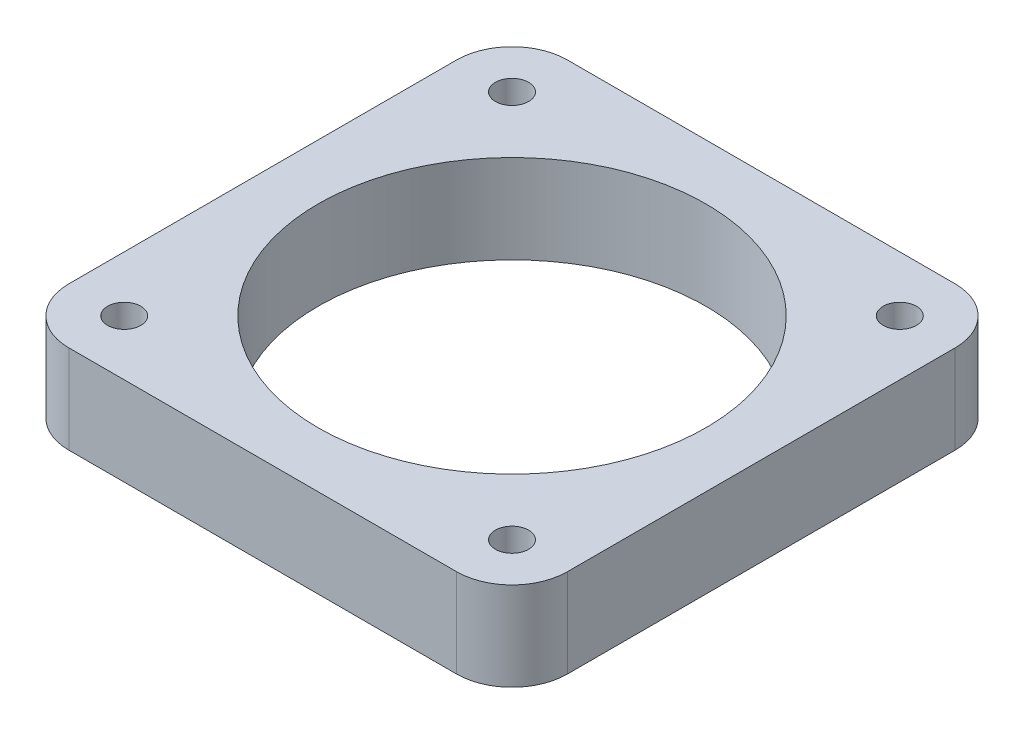
ISO-10303-21;
HEADER;
FILE_DESCRIPTION(('STEP AP214'),'2;1');
FILE_NAME('part.step','',(''),(''),'','','');
FILE_SCHEMA(('AUTOMOTIVE_DESIGN { 1 0 10303 214 1 1 1 1 }'));
ENDSEC;
DATA;
#1=APPLICATION_CONTEXT('core data for automotive mechanical design processes');
#2=APPLICATION_PROTOCOL_DEFINITION('international standard','automotive_design',2000,#1);
#3=PRODUCT_CONTEXT('',#1,'mechanical');
#4=PRODUCT('Part','Part','',(#3));
#5=PRODUCT_RELATED_PRODUCT_CATEGORY('part','',(#4));
#6=PRODUCT_DEFINITION_FORMATION('','',#4);
#7=PRODUCT_DEFINITION_CONTEXT('part definition',#1,'design');
#8=PRODUCT_DEFINITION('design','',#6,#7);
#9=PRODUCT_DEFINITION_SHAPE('','',#8);
#10=(LENGTH_UNIT() NAMED_UNIT(*) SI_UNIT(.MILLI.,.METRE.));
#11=(NAMED_UNIT(*) PLANE_ANGLE_UNIT() SI_UNIT($,.RADIAN.));
#12=(NAMED_UNIT(*) SI_UNIT($,.STERADIAN.) SOLID_ANGLE_UNIT());
#13=UNCERTAINTY_MEASURE_WITH_UNIT(LENGTH_MEASURE(1.E-05),#10,'distance_accuracy_value','');
#14=(GEOMETRIC_REPRESENTATION_CONTEXT(3) GLOBAL_UNCERTAINTY_ASSIGNED_CONTEXT((#13)) GLOBAL_UNIT_ASSIGNED_CONTEXT((#10,
#11,#12)) REPRESENTATION_CONTEXT('',''));
#15=CARTESIAN_POINT('',(0.,0.,0.));
#16=DIRECTION('',(0.,0.,1.));
#17=DIRECTION('',(1.,0.,0.));
#18=AXIS2_PLACEMENT_3D('',#15,#16,#17);
#19=CARTESIAN_POINT('',(0.,8.,22.5000000000002));
#20=DIRECTION('',(0.,0.,-1.));
#21=DIRECTION('',(-1.,0.,0.));
#22=AXIS2_PLACEMENT_3D('',#19,#20,#21);
#23=PLANE('',#22);
#24=DIRECTION('',(1.,0.,0.));
#25=VECTOR('',#24,1.);
#26=CARTESIAN_POINT('',(0.,8.,22.5000000000002));
#27=LINE('',#26,#25);
#28=CARTESIAN_POINT('',(-17.5,8.,22.5000000000002));
#29=VERTEX_POINT('',#28);
#30=CARTESIAN_POINT('',(17.5,8.,22.5000000000002));
#31=VERTEX_POINT('',#30);
#32=EDGE_CURVE('E128',#29,#31,#27,.T.);
#33=ORIENTED_EDGE('',*,*,#32,.F.);
#34=DIRECTION('',(0.,-1.,0.));
#35=VECTOR('',#34,1.);
#36=CARTESIAN_POINT('',(-17.5,0.,22.5000000000002));
#37=LINE('',#36,#35);
#38=CARTESIAN_POINT('',(-17.5,0.,22.5000000000002));
#39=VERTEX_POINT('',#38);
#40=EDGE_CURVE('E112',#29,#39,#37,.T.);
#41=ORIENTED_EDGE('',*,*,#40,.T.);
#42=DIRECTION('',(1.,0.,0.));
#43=VECTOR('',#42,1.);
#44=CARTESIAN_POINT('',(0.,0.,22.5000000000002));
#45=LINE('',#44,#43);
#46=CARTESIAN_POINT('',(17.5,0.,22.5000000000002));
#47=VERTEX_POINT('',#46);
#48=EDGE_CURVE('E125',#39,#47,#45,.T.);
#49=ORIENTED_EDGE('',*,*,#48,.T.);
#50=DIRECTION('',(0.,-1.,0.));
#51=VECTOR('',#50,1.);
#52=CARTESIAN_POINT('',(17.5,8.,22.5000000000002));
#53=LINE('',#52,#51);
#54=EDGE_CURVE('E131',#47,#31,#53,.F.);
#55=ORIENTED_EDGE('',*,*,#54,.T.);
#56=EDGE_LOOP('',(#33,#41,#49,#55));
#57=FACE_BOUND('',#56,.T.);
#58=ADVANCED_FACE('F41',(#57),#23,.F.);
#59=CARTESIAN_POINT('',(22.5,8.,0.));
#60=DIRECTION('',(-1.,0.,0.));
#61=DIRECTION('',(0.,0.,1.));
#62=AXIS2_PLACEMENT_3D('',#59,#60,#61);
#63=PLANE('',#62);
#64=DIRECTION('',(0.,0.,-1.));
#65=VECTOR('',#64,1.);
#66=CARTESIAN_POINT('',(22.5,0.,0.));
#67=LINE('',#66,#65);
#68=CARTESIAN_POINT('',(22.5,0.,17.5000000000002));
#69=VERTEX_POINT('',#68);
#70=CARTESIAN_POINT('',(22.5,0.,-17.5000000000002));
#71=VERTEX_POINT('',#70);
#72=EDGE_CURVE('E136',#69,#71,#67,.T.);
#73=ORIENTED_EDGE('',*,*,#72,.T.);
#74=DIRECTION('',(0.,-1.,0.));
#75=VECTOR('',#74,1.);
#76=CARTESIAN_POINT('',(22.5,8.,-17.5000000000002));
#77=LINE('',#76,#75);
#78=CARTESIAN_POINT('',(22.5,8.,-17.5000000000002));
#79=VERTEX_POINT('',#78);
#80=EDGE_CURVE('E11',#71,#79,#77,.F.);
#81=ORIENTED_EDGE('',*,*,#80,.T.);
#82=DIRECTION('',(0.,0.,-1.));
#83=VECTOR('',#82,1.);
#84=CARTESIAN_POINT('',(22.5,8.,0.));
#85=LINE('',#84,#83);
#86=CARTESIAN_POINT('',(22.5,8.,17.5000000000002));
#87=VERTEX_POINT('',#86);
#88=EDGE_CURVE('E194',#87,#79,#85,.T.);
#89=ORIENTED_EDGE('',*,*,#88,.F.);
#90=DIRECTION('',(0.,-1.,0.));
#91=VECTOR('',#90,1.);
#92=CARTESIAN_POINT('',(22.5,8.,17.5000000000002));
#93=LINE('',#92,#91);
#94=EDGE_CURVE('E50',#87,#69,#93,.T.);
#95=ORIENTED_EDGE('',*,*,#94,.T.);
#96=EDGE_LOOP('',(#73,#81,#89,#95));
#97=FACE_BOUND('',#96,.T.);
#98=ADVANCED_FACE('F192',(#97),#63,.F.);
#99=CARTESIAN_POINT('',(0.,8.,-22.5000000000002));
#100=DIRECTION('',(0.,0.,-1.));
#101=DIRECTION('',(-1.,0.,0.));
#102=AXIS2_PLACEMENT_3D('',#99,#100,#101);
#103=PLANE('',#102);
#104=DIRECTION('',(1.,0.,0.));
#105=VECTOR('',#104,1.);
#106=CARTESIAN_POINT('',(0.,0.,-22.5000000000002));
#107=LINE('',#106,#105);
#108=CARTESIAN_POINT('',(-17.5,0.,-22.5000000000002));
#109=VERTEX_POINT('',#108);
#110=CARTESIAN_POINT('',(17.5,0.,-22.5000000000002));
#111=VERTEX_POINT('',#110);
#112=EDGE_CURVE('E142',#109,#111,#107,.T.);
#113=ORIENTED_EDGE('',*,*,#112,.F.);
#114=DIRECTION('',(0.,-1.,0.));
#115=VECTOR('',#114,1.);
#116=CARTESIAN_POINT('',(-17.5,8.,-22.5000000000002));
#117=LINE('',#116,#115);
#118=CARTESIAN_POINT('',(-17.5,8.,-22.5000000000002));
#119=VERTEX_POINT('',#118);
#120=EDGE_CURVE('E64',#109,#119,#117,.F.);
#121=ORIENTED_EDGE('',*,*,#120,.T.);
#122=DIRECTION('',(1.,0.,0.));
#123=VECTOR('',#122,1.);
#124=CARTESIAN_POINT('',(0.,8.,-22.5000000000002));
#125=LINE('',#124,#123);
#126=CARTESIAN_POINT('',(17.5,8.,-22.5000000000002));
#127=VERTEX_POINT('',#126);
#128=EDGE_CURVE('E201',#119,#127,#125,.T.);
#129=ORIENTED_EDGE('',*,*,#128,.T.);
#130=DIRECTION('',(0.,-1.,0.));
#131=VECTOR('',#130,1.);
#132=CARTESIAN_POINT('',(17.5,0.,-22.5000000000002));
#133=LINE('',#132,#131);
#134=EDGE_CURVE('E182',#127,#111,#133,.T.);
#135=ORIENTED_EDGE('',*,*,#134,.T.);
#136=EDGE_LOOP('',(#113,#121,#129,#135));
#137=FACE_BOUND('',#136,.T.);
#138=ADVANCED_FACE('F200',(#137),#103,.T.);
#139=CARTESIAN_POINT('',(17.5,8.,17.5));
#140=DIRECTION('',(0.,-1.,0.));
#141=DIRECTION('',(0.,0.,-1.));
#142=AXIS2_PLACEMENT_3D('',#139,#140,#141);
#143=CYLINDRICAL_SURFACE('',#142,1.5);
#144=CARTESIAN_POINT('',(17.5,8.,17.5));
#145=DIRECTION('',(0.,1.,0.));
#146=DIRECTION('',(0.,0.,1.));
#147=AXIS2_PLACEMENT_3D('',#144,#145,#146);
#148=CIRCLE('',#147,1.5);
#149=CARTESIAN_POINT('',(17.5,8.,19.));
#150=VERTEX_POINT('',#149);
#151=EDGE_CURVE('E283',#150,#150,#148,.T.);
#152=ORIENTED_EDGE('',*,*,#151,.T.);
#153=EDGE_LOOP('',(#152));
#154=FACE_BOUND('',#153,.T.);
#155=CARTESIAN_POINT('',(17.5,0.,17.5));
#156=DIRECTION('',(0.,1.,0.));
#157=DIRECTION('',(0.,0.,1.));
#158=AXIS2_PLACEMENT_3D('',#155,#156,#157);
#159=CIRCLE('',#158,1.5);
#160=CARTESIAN_POINT('',(17.5,0.,19.));
#161=VERTEX_POINT('',#160);
#162=EDGE_CURVE('E137',#161,#161,#159,.T.);
#163=ORIENTED_EDGE('',*,*,#162,.F.);
#164=EDGE_LOOP('',(#163));
#165=FACE_BOUND('',#164,.T.);
#166=ADVANCED_FACE('F232',(#154,#165),#143,.F.);
#167=CARTESIAN_POINT('',(-17.5,8.,17.5));
#168=DIRECTION('',(0.,-1.,0.));
#169=DIRECTION('',(0.,0.,-1.));
#170=AXIS2_PLACEMENT_3D('',#167,#168,#169);
#171=CYLINDRICAL_SURFACE('',#170,1.5);
#172=CARTESIAN_POINT('',(-17.5,8.,17.5));
#173=DIRECTION('',(0.,1.,0.));
#174=DIRECTION('',(0.,0.,1.));
#175=AXIS2_PLACEMENT_3D('',#172,#173,#174);
#176=CIRCLE('',#175,1.5);
#177=CARTESIAN_POINT('',(-17.5,8.,19.));
#178=VERTEX_POINT('',#177);
#179=EDGE_CURVE('E280',#178,#178,#176,.T.);
#180=ORIENTED_EDGE('',*,*,#179,.T.);
#181=EDGE_LOOP('',(#180));
#182=FACE_BOUND('',#181,.T.);
#183=CARTESIAN_POINT('',(-17.5,0.,17.5));
#184=DIRECTION('',(0.,1.,0.));
#185=DIRECTION('',(0.,0.,1.));
#186=AXIS2_PLACEMENT_3D('',#183,#184,#185);
#187=CIRCLE('',#186,1.5);
#188=CARTESIAN_POINT('',(-17.5,0.,19.));
#189=VERTEX_POINT('',#188);
#190=EDGE_CURVE('E145',#189,#189,#187,.T.);
#191=ORIENTED_EDGE('',*,*,#190,.F.);
#192=EDGE_LOOP('',(#191));
#193=FACE_BOUND('',#192,.T.);
#194=ADVANCED_FACE('F229',(#182,#193),#171,.F.);
#195=CARTESIAN_POINT('',(17.5,8.,-17.5));
#196=DIRECTION('',(0.,-1.,0.));
#197=DIRECTION('',(0.,0.,-1.));
#198=AXIS2_PLACEMENT_3D('',#195,#196,#197);
#199=CYLINDRICAL_SURFACE('',#198,1.5);
#200=CARTESIAN_POINT('',(17.5,8.,-17.5));
#201=DIRECTION('',(0.,1.,0.));
#202=DIRECTION('',(0.,0.,1.));
#203=AXIS2_PLACEMENT_3D('',#200,#201,#202);
#204=CIRCLE('',#203,1.5);
#205=CARTESIAN_POINT('',(17.5,8.,-16.));
#206=VERTEX_POINT('',#205);
#207=EDGE_CURVE('E277',#206,#206,#204,.T.);
#208=ORIENTED_EDGE('',*,*,#207,.T.);
#209=EDGE_LOOP('',(#208));
#210=FACE_BOUND('',#209,.T.);
#211=CARTESIAN_POINT('',(17.5,0.,-17.5));
#212=DIRECTION('',(0.,1.,0.));
#213=DIRECTION('',(0.,0.,1.));
#214=AXIS2_PLACEMENT_3D('',#211,#212,#213);
#215=CIRCLE('',#214,1.5);
#216=CARTESIAN_POINT('',(17.5,0.,-16.));
#217=VERTEX_POINT('',#216);
#218=EDGE_CURVE('E220',#217,#217,#215,.T.);
#219=ORIENTED_EDGE('',*,*,#218,.F.);
#220=EDGE_LOOP('',(#219));
#221=FACE_BOUND('',#220,.T.);
#222=ADVANCED_FACE('F231',(#210,#221),#199,.F.);
#223=CARTESIAN_POINT('',(-17.5,8.,-17.5));
#224=DIRECTION('',(0.,-1.,0.));
#225=DIRECTION('',(0.,0.,-1.));
#226=AXIS2_PLACEMENT_3D('',#223,#224,#225);
#227=CYLINDRICAL_SURFACE('',#226,1.5);
#228=CARTESIAN_POINT('',(-17.5,8.,-17.5));
#229=DIRECTION('',(0.,1.,0.));
#230=DIRECTION('',(0.,0.,1.));
#231=AXIS2_PLACEMENT_3D('',#228,#229,#230);
#232=CIRCLE('',#231,1.5);
#233=CARTESIAN_POINT('',(-17.5,8.,-16.));
#234=VERTEX_POINT('',#233);
#235=EDGE_CURVE('E273',#234,#234,#232,.T.);
#236=ORIENTED_EDGE('',*,*,#235,.T.);
#237=EDGE_LOOP('',(#236));
#238=FACE_BOUND('',#237,.T.);
#239=CARTESIAN_POINT('',(-17.5,0.,-17.5));
#240=DIRECTION('',(0.,1.,0.));
#241=DIRECTION('',(0.,0.,1.));
#242=AXIS2_PLACEMENT_3D('',#239,#240,#241);
#243=CIRCLE('',#242,1.5);
#244=CARTESIAN_POINT('',(-17.5,0.,-16.));
#245=VERTEX_POINT('',#244);
#246=EDGE_CURVE('E216',#245,#245,#243,.T.);
#247=ORIENTED_EDGE('',*,*,#246,.F.);
#248=EDGE_LOOP('',(#247));
#249=FACE_BOUND('',#248,.T.);
#250=ADVANCED_FACE('F239',(#238,#249),#227,.F.);
#251=CARTESIAN_POINT('',(0.,8.,0.));
#252=DIRECTION('',(0.,-1.,0.));
#253=DIRECTION('',(0.,0.,-1.));
#254=AXIS2_PLACEMENT_3D('',#251,#252,#253);
#255=CYLINDRICAL_SURFACE('',#254,17.5);
#256=CARTESIAN_POINT('',(0.,8.,0.));
#257=DIRECTION('',(0.,1.,0.));
#258=DIRECTION('',(0.,0.,1.));
#259=AXIS2_PLACEMENT_3D('',#256,#257,#258);
#260=CIRCLE('',#259,17.5);
#261=CARTESIAN_POINT('',(0.,8.,17.5));
#262=VERTEX_POINT('',#261);
#263=EDGE_CURVE('E155',#262,#262,#260,.T.);
#264=ORIENTED_EDGE('',*,*,#263,.T.);
#265=EDGE_LOOP('',(#264));
#266=FACE_BOUND('',#265,.T.);
#267=CARTESIAN_POINT('',(0.,0.,0.));
#268=DIRECTION('',(0.,1.,0.));
#269=DIRECTION('',(0.,0.,1.));
#270=AXIS2_PLACEMENT_3D('',#267,#268,#269);
#271=CIRCLE('',#270,17.5);
#272=CARTESIAN_POINT('',(0.,0.,17.5));
#273=VERTEX_POINT('',#272);
#274=EDGE_CURVE('E212',#273,#273,#271,.T.);
#275=ORIENTED_EDGE('',*,*,#274,.F.);
#276=EDGE_LOOP('',(#275));
#277=FACE_BOUND('',#276,.T.);
#278=ADVANCED_FACE('F258',(#266,#277),#255,.F.);
#279=CARTESIAN_POINT('',(-22.5,8.,0.));
#280=DIRECTION('',(-1.,0.,0.));
#281=DIRECTION('',(0.,0.,1.));
#282=AXIS2_PLACEMENT_3D('',#279,#280,#281);
#283=PLANE('',#282);
#284=DIRECTION('',(0.,0.,-1.));
#285=VECTOR('',#284,1.);
#286=CARTESIAN_POINT('',(-22.5,0.,0.));
#287=LINE('',#286,#285);
#288=CARTESIAN_POINT('',(-22.5,0.,17.5000000000002));
#289=VERTEX_POINT('',#288);
#290=CARTESIAN_POINT('',(-22.5,0.,-17.5000000000001));
#291=VERTEX_POINT('',#290);
#292=EDGE_CURVE('E152',#289,#291,#287,.T.);
#293=ORIENTED_EDGE('',*,*,#292,.F.);
#294=DIRECTION('',(0.,-1.,0.));
#295=VECTOR('',#294,1.);
#296=CARTESIAN_POINT('',(-22.5,8.,17.5000000000002));
#297=LINE('',#296,#295);
#298=CARTESIAN_POINT('',(-22.5,8.,17.5000000000002));
#299=VERTEX_POINT('',#298);
#300=EDGE_CURVE('E113',#289,#299,#297,.F.);
#301=ORIENTED_EDGE('',*,*,#300,.T.);
#302=DIRECTION('',(0.,0.,-1.));
#303=VECTOR('',#302,1.);
#304=CARTESIAN_POINT('',(-22.5,8.,0.));
#305=LINE('',#304,#303);
#306=CARTESIAN_POINT('',(-22.5,8.,-17.5000000000001));
#307=VERTEX_POINT('',#306);
#308=EDGE_CURVE('E157',#299,#307,#305,.T.);
#309=ORIENTED_EDGE('',*,*,#308,.T.);
#310=DIRECTION('',(0.,-1.,0.));
#311=VECTOR('',#310,1.);
#312=CARTESIAN_POINT('',(-22.5,8.,-17.5000000000001));
#313=LINE('',#312,#311);
#314=EDGE_CURVE('E119',#307,#291,#313,.T.);
#315=ORIENTED_EDGE('',*,*,#314,.T.);
#316=EDGE_LOOP('',(#293,#301,#309,#315));
#317=FACE_BOUND('',#316,.T.);
#318=ADVANCED_FACE('F254',(#317),#283,.T.);
#319=CARTESIAN_POINT('',(0.,8.,0.));
#320=DIRECTION('',(0.,1.,0.));
#321=DIRECTION('',(0.,0.,1.));
#322=AXIS2_PLACEMENT_3D('',#319,#320,#321);
#323=PLANE('',#322);
#324=ORIENTED_EDGE('',*,*,#263,.F.);
#325=EDGE_LOOP('',(#324));
#326=FACE_BOUND('',#325,.T.);
#327=ORIENTED_EDGE('',*,*,#235,.F.);
#328=EDGE_LOOP('',(#327));
#329=FACE_BOUND('',#328,.T.);
#330=ORIENTED_EDGE('',*,*,#207,.F.);
#331=EDGE_LOOP('',(#330));
#332=FACE_BOUND('',#331,.T.);
#333=ORIENTED_EDGE('',*,*,#179,.F.);
#334=EDGE_LOOP('',(#333));
#335=FACE_BOUND('',#334,.T.);
#336=ORIENTED_EDGE('',*,*,#151,.F.);
#337=EDGE_LOOP('',(#336));
#338=FACE_BOUND('',#337,.T.);
#339=ORIENTED_EDGE('',*,*,#308,.F.);
#340=CARTESIAN_POINT('',(-17.5,8.,17.5000000000002));
#341=DIRECTION('',(0.,1.,0.));
#342=DIRECTION('',(0.,0.,1.));
#343=AXIS2_PLACEMENT_3D('',#340,#341,#342);
#344=CIRCLE('',#343,5.);
#345=EDGE_CURVE('E179',#299,#29,#344,.T.);
#346=ORIENTED_EDGE('',*,*,#345,.T.);
#347=ORIENTED_EDGE('',*,*,#32,.T.);
#348=CARTESIAN_POINT('',(17.5,8.,17.5000000000002));
#349=DIRECTION('',(0.,1.,0.));
#350=DIRECTION('',(0.,0.,1.));
#351=AXIS2_PLACEMENT_3D('',#348,#349,#350);
#352=CIRCLE('',#351,5.);
#353=EDGE_CURVE('E171',#31,#87,#352,.T.);
#354=ORIENTED_EDGE('',*,*,#353,.T.);
#355=ORIENTED_EDGE('',*,*,#88,.T.);
#356=CARTESIAN_POINT('',(17.5,8.,-17.5000000000002));
#357=DIRECTION('',(0.,1.,0.));
#358=DIRECTION('',(0.,0.,1.));
#359=AXIS2_PLACEMENT_3D('',#356,#357,#358);
#360=CIRCLE('',#359,5.);
#361=EDGE_CURVE('E57',#79,#127,#360,.T.);
#362=ORIENTED_EDGE('',*,*,#361,.T.);
#363=ORIENTED_EDGE('',*,*,#128,.F.);
#364=CARTESIAN_POINT('',(-17.5,8.,-17.5000000000001));
#365=DIRECTION('',(0.,1.,0.));
#366=DIRECTION('',(0.,0.,1.));
#367=AXIS2_PLACEMENT_3D('',#364,#365,#366);
#368=CIRCLE('',#367,5.);
#369=EDGE_CURVE('E176',#119,#307,#368,.T.);
#370=ORIENTED_EDGE('',*,*,#369,.T.);
#371=EDGE_LOOP('',(#339,#346,#347,#354,#355,#362,#363,#370));
#372=FACE_BOUND('',#371,.T.);
#373=ADVANCED_FACE('F257',(#326,#329,#332,#335,#338,#372),#323,.T.);
#374=CARTESIAN_POINT('',(0.,0.,0.));
#375=DIRECTION('',(0.,1.,0.));
#376=DIRECTION('',(0.,0.,1.));
#377=AXIS2_PLACEMENT_3D('',#374,#375,#376);
#378=PLANE('',#377);
#379=ORIENTED_EDGE('',*,*,#274,.T.);
#380=EDGE_LOOP('',(#379));
#381=FACE_BOUND('',#380,.T.);
#382=ORIENTED_EDGE('',*,*,#246,.T.);
#383=EDGE_LOOP('',(#382));
#384=FACE_BOUND('',#383,.T.);
#385=ORIENTED_EDGE('',*,*,#218,.T.);
#386=EDGE_LOOP('',(#385));
#387=FACE_BOUND('',#386,.T.);
#388=ORIENTED_EDGE('',*,*,#190,.T.);
#389=EDGE_LOOP('',(#388));
#390=FACE_BOUND('',#389,.T.);
#391=ORIENTED_EDGE('',*,*,#162,.T.);
#392=EDGE_LOOP('',(#391));
#393=FACE_BOUND('',#392,.T.);
#394=ORIENTED_EDGE('',*,*,#48,.F.);
#395=CARTESIAN_POINT('',(-17.5,0.,17.5000000000002));
#396=DIRECTION('',(0.,1.,0.));
#397=DIRECTION('',(0.,0.,1.));
#398=AXIS2_PLACEMENT_3D('',#395,#396,#397);
#399=CIRCLE('',#398,5.);
#400=EDGE_CURVE('E108',#39,#289,#399,.F.);
#401=ORIENTED_EDGE('',*,*,#400,.T.);
#402=ORIENTED_EDGE('',*,*,#292,.T.);
#403=CARTESIAN_POINT('',(-17.5,0.,-17.5000000000001));
#404=DIRECTION('',(0.,1.,0.));
#405=DIRECTION('',(0.,0.,1.));
#406=AXIS2_PLACEMENT_3D('',#403,#404,#405);
#407=CIRCLE('',#406,5.);
#408=EDGE_CURVE('E120',#291,#109,#407,.F.);
#409=ORIENTED_EDGE('',*,*,#408,.T.);
#410=ORIENTED_EDGE('',*,*,#112,.T.);
#411=CARTESIAN_POINT('',(17.5,0.,-17.5000000000002));
#412=DIRECTION('',(0.,1.,0.));
#413=DIRECTION('',(0.,0.,1.));
#414=AXIS2_PLACEMENT_3D('',#411,#412,#413);
#415=CIRCLE('',#414,5.);
#416=EDGE_CURVE('E161',#111,#71,#415,.F.);
#417=ORIENTED_EDGE('',*,*,#416,.T.);
#418=ORIENTED_EDGE('',*,*,#72,.F.);
#419=CARTESIAN_POINT('',(17.5,0.,17.5000000000002));
#420=DIRECTION('',(0.,1.,0.));
#421=DIRECTION('',(0.,0.,1.));
#422=AXIS2_PLACEMENT_3D('',#419,#420,#421);
#423=CIRCLE('',#422,5.);
#424=EDGE_CURVE('E130',#69,#47,#423,.F.);
#425=ORIENTED_EDGE('',*,*,#424,.T.);
#426=EDGE_LOOP('',(#394,#401,#402,#409,#410,#417,#418,#425));
#427=FACE_BOUND('',#426,.T.);
#428=ADVANCED_FACE('F133',(#381,#384,#387,#390,#393,#427),#378,.F.);
#429=CARTESIAN_POINT('',(-17.5,8.,17.5000000000002));
#430=DIRECTION('',(0.,1.,0.));
#431=DIRECTION('',(0.,0.,1.));
#432=AXIS2_PLACEMENT_3D('',#429,#430,#431);
#433=CYLINDRICAL_SURFACE('',#432,5.);
#434=ORIENTED_EDGE('',*,*,#345,.F.);
#435=ORIENTED_EDGE('',*,*,#300,.F.);
#436=ORIENTED_EDGE('',*,*,#400,.F.);
#437=ORIENTED_EDGE('',*,*,#40,.F.);
#438=EDGE_LOOP('',(#434,#435,#436,#437));
#439=FACE_BOUND('',#438,.T.);
#440=ADVANCED_FACE('F111',(#439),#433,.T.);
#441=CARTESIAN_POINT('',(-17.5,8.,-17.5000000000001));
#442=DIRECTION('',(0.,-1.,0.));
#443=DIRECTION('',(0.,0.,-1.));
#444=AXIS2_PLACEMENT_3D('',#441,#442,#443);
#445=CYLINDRICAL_SURFACE('',#444,5.);
#446=ORIENTED_EDGE('',*,*,#369,.F.);
#447=ORIENTED_EDGE('',*,*,#120,.F.);
#448=ORIENTED_EDGE('',*,*,#408,.F.);
#449=ORIENTED_EDGE('',*,*,#314,.F.);
#450=EDGE_LOOP('',(#446,#447,#448,#449));
#451=FACE_BOUND('',#450,.T.);
#452=ADVANCED_FACE('F287',(#451),#445,.T.);
#453=CARTESIAN_POINT('',(17.5,8.,-17.5000000000002));
#454=DIRECTION('',(0.,1.,0.));
#455=DIRECTION('',(0.,0.,1.));
#456=AXIS2_PLACEMENT_3D('',#453,#454,#455);
#457=CYLINDRICAL_SURFACE('',#456,5.);
#458=ORIENTED_EDGE('',*,*,#361,.F.);
#459=ORIENTED_EDGE('',*,*,#80,.F.);
#460=ORIENTED_EDGE('',*,*,#416,.F.);
#461=ORIENTED_EDGE('',*,*,#134,.F.);
#462=EDGE_LOOP('',(#458,#459,#460,#461));
#463=FACE_BOUND('',#462,.T.);
#464=ADVANCED_FACE('F199',(#463),#457,.T.);
#465=CARTESIAN_POINT('',(17.5,8.,17.5000000000002));
#466=DIRECTION('',(0.,-1.,0.));
#467=DIRECTION('',(0.,0.,-1.));
#468=AXIS2_PLACEMENT_3D('',#465,#466,#467);
#469=CYLINDRICAL_SURFACE('',#468,5.);
#470=ORIENTED_EDGE('',*,*,#353,.F.);
#471=ORIENTED_EDGE('',*,*,#54,.F.);
#472=ORIENTED_EDGE('',*,*,#424,.F.);
#473=ORIENTED_EDGE('',*,*,#94,.F.);
#474=EDGE_LOOP('',(#470,#471,#472,#473));
#475=FACE_BOUND('',#474,.T.);
#476=ADVANCED_FACE('F43',(#475),#469,.T.);
#477=CLOSED_SHELL('',(#58,#98,#138,#166,#194,#222,#250,#278,#318,#373,#428,#440,#452,#464,#476));
#478=MANIFOLD_SOLID_BREP('B2',#477);
#479=ADVANCED_BREP_SHAPE_REPRESENTATION('',(#18,#478),#14);
#480=SHAPE_DEFINITION_REPRESENTATION(#9,#479);
ENDSEC;
END-ISO-10303-21;
